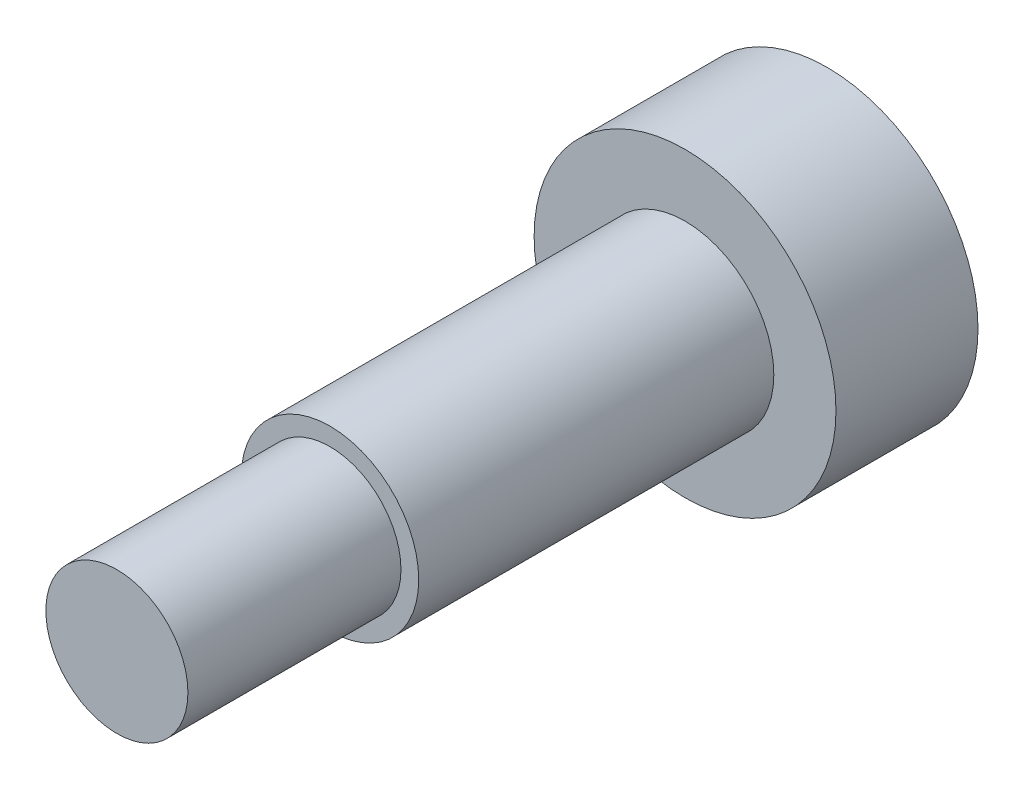
ISO-10303-21;
HEADER;
FILE_DESCRIPTION(('STEP AP214'),'2;1');
FILE_NAME('part.step','',(''),(''),'','','');
FILE_SCHEMA(('AUTOMOTIVE_DESIGN { 1 0 10303 214 1 1 1 1 }'));
ENDSEC;
DATA;
#1=APPLICATION_CONTEXT('core data for automotive mechanical design processes');
#2=APPLICATION_PROTOCOL_DEFINITION('international standard','automotive_design',2000,#1);
#3=PRODUCT_CONTEXT('',#1,'mechanical');
#4=PRODUCT('Part','Part','',(#3));
#5=PRODUCT_RELATED_PRODUCT_CATEGORY('part','',(#4));
#6=PRODUCT_DEFINITION_FORMATION('','',#4);
#7=PRODUCT_DEFINITION_CONTEXT('part definition',#1,'design');
#8=PRODUCT_DEFINITION('design','',#6,#7);
#9=PRODUCT_DEFINITION_SHAPE('','',#8);
#10=(LENGTH_UNIT() NAMED_UNIT(*) SI_UNIT(.MILLI.,.METRE.));
#11=(NAMED_UNIT(*) PLANE_ANGLE_UNIT() SI_UNIT($,.RADIAN.));
#12=(NAMED_UNIT(*) SI_UNIT($,.STERADIAN.) SOLID_ANGLE_UNIT());
#13=UNCERTAINTY_MEASURE_WITH_UNIT(LENGTH_MEASURE(1.E-05),#10,'distance_accuracy_value','');
#14=(GEOMETRIC_REPRESENTATION_CONTEXT(3) GLOBAL_UNCERTAINTY_ASSIGNED_CONTEXT((#13)) GLOBAL_UNIT_ASSIGNED_CONTEXT((#10,
#11,#12)) REPRESENTATION_CONTEXT('',''));
#15=CARTESIAN_POINT('',(0.,0.,0.));
#16=DIRECTION('',(0.,0.,1.));
#17=DIRECTION('',(1.,0.,0.));
#18=AXIS2_PLACEMENT_3D('',#15,#16,#17);
#19=CARTESIAN_POINT('',(0.,0.,16.));
#20=DIRECTION('',(0.,0.,1.));
#21=DIRECTION('',(1.,0.,0.));
#22=AXIS2_PLACEMENT_3D('',#19,#20,#21);
#23=PLANE('',#22);
#24=CARTESIAN_POINT('',(0.,0.,16.));
#25=DIRECTION('',(0.,0.,1.));
#26=DIRECTION('',(1.,0.,0.));
#27=AXIS2_PLACEMENT_3D('',#24,#25,#26);
#28=CIRCLE('',#27,2.);
#29=CARTESIAN_POINT('',(2.,0.,16.));
#30=VERTEX_POINT('',#29);
#31=EDGE_CURVE('E10',#30,#30,#28,.T.);
#32=ORIENTED_EDGE('',*,*,#31,.T.);
#33=EDGE_LOOP('',(#32));
#34=FACE_BOUND('',#33,.T.);
#35=ADVANCED_FACE('F15',(#34),#23,.T.);
#36=CARTESIAN_POINT('',(0.,0.,10.));
#37=DIRECTION('',(0.,0.,1.));
#38=DIRECTION('',(1.,0.,0.));
#39=AXIS2_PLACEMENT_3D('',#36,#37,#38);
#40=CYLINDRICAL_SURFACE('',#39,2.);
#41=ORIENTED_EDGE('',*,*,#31,.F.);
#42=EDGE_LOOP('',(#41));
#43=FACE_BOUND('',#42,.T.);
#44=CARTESIAN_POINT('',(0.,0.,10.));
#45=DIRECTION('',(0.,0.,1.));
#46=DIRECTION('',(1.,0.,0.));
#47=AXIS2_PLACEMENT_3D('',#44,#45,#46);
#48=CIRCLE('',#47,2.);
#49=CARTESIAN_POINT('',(2.,0.,10.));
#50=VERTEX_POINT('',#49);
#51=EDGE_CURVE('E22',#50,#50,#48,.T.);
#52=ORIENTED_EDGE('',*,*,#51,.T.);
#53=EDGE_LOOP('',(#52));
#54=FACE_BOUND('',#53,.T.);
#55=ADVANCED_FACE('F84',(#43,#54),#40,.T.);
#56=CARTESIAN_POINT('',(0.,0.,-1.5));
#57=DIRECTION('',(0.,0.,1.));
#58=DIRECTION('',(1.,0.,0.));
#59=AXIS2_PLACEMENT_3D('',#56,#57,#58);
#60=PLANE('',#59);
#61=CARTESIAN_POINT('',(0.,0.,-1.5));
#62=DIRECTION('',(0.,0.,1.));
#63=DIRECTION('',(1.,0.,0.));
#64=AXIS2_PLACEMENT_3D('',#61,#62,#63);
#65=CIRCLE('',#64,1.5);
#66=CARTESIAN_POINT('',(1.5,0.,-1.5));
#67=VERTEX_POINT('',#66);
#68=EDGE_CURVE('E31',#67,#67,#65,.T.);
#69=ORIENTED_EDGE('',*,*,#68,.F.);
#70=EDGE_LOOP('',(#69));
#71=FACE_BOUND('',#70,.T.);
#72=ADVANCED_FACE('F88',(#71),#60,.F.);
#73=CARTESIAN_POINT('',(0.,0.,10.));
#74=DIRECTION('',(0.,0.,1.));
#75=DIRECTION('',(1.,0.,0.));
#76=AXIS2_PLACEMENT_3D('',#73,#74,#75);
#77=PLANE('',#76);
#78=ORIENTED_EDGE('',*,*,#51,.F.);
#79=EDGE_LOOP('',(#78));
#80=FACE_BOUND('',#79,.T.);
#81=CARTESIAN_POINT('',(0.,0.,10.));
#82=DIRECTION('',(0.,0.,1.));
#83=DIRECTION('',(1.,0.,0.));
#84=AXIS2_PLACEMENT_3D('',#81,#82,#83);
#85=CIRCLE('',#84,2.5);
#86=CARTESIAN_POINT('',(2.5,0.,10.));
#87=VERTEX_POINT('',#86);
#88=EDGE_CURVE('E38',#87,#87,#85,.T.);
#89=ORIENTED_EDGE('',*,*,#88,.T.);
#90=EDGE_LOOP('',(#89));
#91=FACE_BOUND('',#90,.T.);
#92=ADVANCED_FACE('F93',(#80,#91),#77,.T.);
#93=CARTESIAN_POINT('',(0.,0.,-4.));
#94=DIRECTION('',(0.,0.,1.));
#95=DIRECTION('',(1.,0.,0.));
#96=AXIS2_PLACEMENT_3D('',#93,#94,#95);
#97=CYLINDRICAL_SURFACE('',#96,1.5);
#98=ORIENTED_EDGE('',*,*,#68,.T.);
#99=EDGE_LOOP('',(#98));
#100=FACE_BOUND('',#99,.T.);
#101=CARTESIAN_POINT('',(0.,0.,-4.));
#102=DIRECTION('',(0.,0.,1.));
#103=DIRECTION('',(1.,0.,0.));
#104=AXIS2_PLACEMENT_3D('',#101,#102,#103);
#105=CIRCLE('',#104,1.5);
#106=CARTESIAN_POINT('',(1.5,0.,-4.));
#107=VERTEX_POINT('',#106);
#108=EDGE_CURVE('E42',#107,#107,#105,.T.);
#109=ORIENTED_EDGE('',*,*,#108,.F.);
#110=EDGE_LOOP('',(#109));
#111=FACE_BOUND('',#110,.T.);
#112=ADVANCED_FACE('F80',(#100,#111),#97,.F.);
#113=CARTESIAN_POINT('',(0.,0.,0.));
#114=DIRECTION('',(0.,0.,1.));
#115=DIRECTION('',(1.,0.,0.));
#116=AXIS2_PLACEMENT_3D('',#113,#114,#115);
#117=CYLINDRICAL_SURFACE('',#116,2.5);
#118=ORIENTED_EDGE('',*,*,#88,.F.);
#119=EDGE_LOOP('',(#118));
#120=FACE_BOUND('',#119,.T.);
#121=CARTESIAN_POINT('',(0.,0.,0.));
#122=DIRECTION('',(0.,0.,1.));
#123=DIRECTION('',(1.,0.,0.));
#124=AXIS2_PLACEMENT_3D('',#121,#122,#123);
#125=CIRCLE('',#124,2.5);
#126=CARTESIAN_POINT('',(2.5,0.,0.));
#127=VERTEX_POINT('',#126);
#128=EDGE_CURVE('E46',#127,#127,#125,.T.);
#129=ORIENTED_EDGE('',*,*,#128,.T.);
#130=EDGE_LOOP('',(#129));
#131=FACE_BOUND('',#130,.T.);
#132=ADVANCED_FACE('F70',(#120,#131),#117,.T.);
#133=CARTESIAN_POINT('',(0.,0.,-4.));
#134=DIRECTION('',(0.,0.,1.));
#135=DIRECTION('',(1.,0.,0.));
#136=AXIS2_PLACEMENT_3D('',#133,#134,#135);
#137=PLANE('',#136);
#138=ORIENTED_EDGE('',*,*,#108,.T.);
#139=EDGE_LOOP('',(#138));
#140=FACE_BOUND('',#139,.T.);
#141=CARTESIAN_POINT('',(0.,0.,-4.));
#142=DIRECTION('',(0.,0.,1.));
#143=DIRECTION('',(1.,0.,0.));
#144=AXIS2_PLACEMENT_3D('',#141,#142,#143);
#145=CIRCLE('',#144,4.25);
#146=CARTESIAN_POINT('',(4.25,0.,-4.));
#147=VERTEX_POINT('',#146);
#148=EDGE_CURVE('E50',#147,#147,#145,.T.);
#149=ORIENTED_EDGE('',*,*,#148,.F.);
#150=EDGE_LOOP('',(#149));
#151=FACE_BOUND('',#150,.T.);
#152=ADVANCED_FACE('F68',(#140,#151),#137,.F.);
#153=CARTESIAN_POINT('',(0.,0.,0.));
#154=DIRECTION('',(0.,0.,1.));
#155=DIRECTION('',(1.,0.,0.));
#156=AXIS2_PLACEMENT_3D('',#153,#154,#155);
#157=PLANE('',#156);
#158=ORIENTED_EDGE('',*,*,#128,.F.);
#159=EDGE_LOOP('',(#158));
#160=FACE_BOUND('',#159,.T.);
#161=CARTESIAN_POINT('',(0.,0.,0.));
#162=DIRECTION('',(0.,0.,1.));
#163=DIRECTION('',(1.,0.,0.));
#164=AXIS2_PLACEMENT_3D('',#161,#162,#163);
#165=CIRCLE('',#164,4.25);
#166=CARTESIAN_POINT('',(4.25,0.,0.));
#167=VERTEX_POINT('',#166);
#168=EDGE_CURVE('E54',#167,#167,#165,.T.);
#169=ORIENTED_EDGE('',*,*,#168,.T.);
#170=EDGE_LOOP('',(#169));
#171=FACE_BOUND('',#170,.T.);
#172=ADVANCED_FACE('F60',(#160,#171),#157,.T.);
#173=CARTESIAN_POINT('',(0.,0.,-4.));
#174=DIRECTION('',(0.,0.,1.));
#175=DIRECTION('',(1.,0.,0.));
#176=AXIS2_PLACEMENT_3D('',#173,#174,#175);
#177=CYLINDRICAL_SURFACE('',#176,4.25);
#178=ORIENTED_EDGE('',*,*,#168,.F.);
#179=EDGE_LOOP('',(#178));
#180=FACE_BOUND('',#179,.T.);
#181=ORIENTED_EDGE('',*,*,#148,.T.);
#182=EDGE_LOOP('',(#181));
#183=FACE_BOUND('',#182,.T.);
#184=ADVANCED_FACE('F62',(#180,#183),#177,.T.);
#185=CLOSED_SHELL('',(#35,#55,#72,#92,#112,#132,#152,#172,#184));
#186=MANIFOLD_SOLID_BREP('B1',#185);
#187=ADVANCED_BREP_SHAPE_REPRESENTATION('',(#18,#186),#14);
#188=SHAPE_DEFINITION_REPRESENTATION(#9,#187);
ENDSEC;
END-ISO-10303-21;
